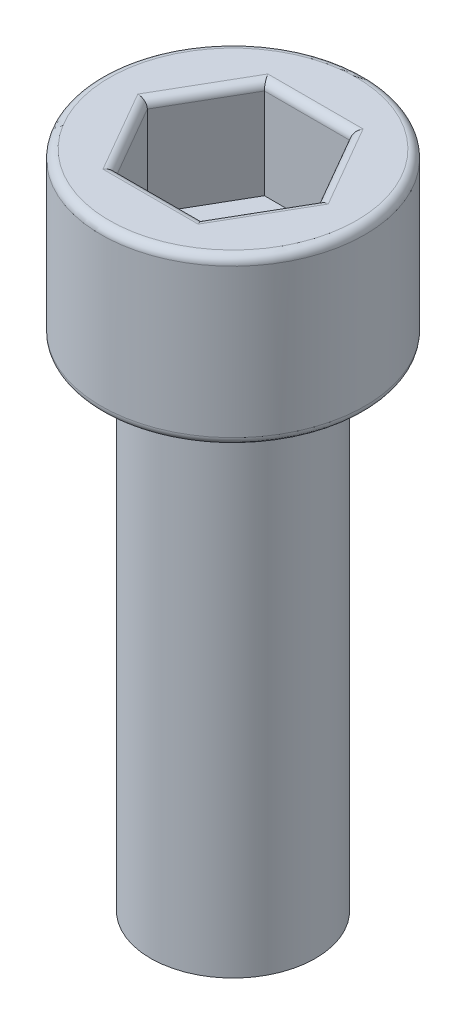
ISO-10303-21;
HEADER;
FILE_DESCRIPTION(('STEP AP214'),'2;1');
FILE_NAME('part.step','',(''),(''),'','','');
FILE_SCHEMA(('AUTOMOTIVE_DESIGN { 1 0 10303 214 1 1 1 1 }'));
ENDSEC;
DATA;
#1=APPLICATION_CONTEXT('core data for automotive mechanical design processes');
#2=APPLICATION_PROTOCOL_DEFINITION('international standard','automotive_design',2000,#1);
#3=PRODUCT_CONTEXT('',#1,'mechanical');
#4=PRODUCT('Part','Part','',(#3));
#5=PRODUCT_RELATED_PRODUCT_CATEGORY('part','',(#4));
#6=PRODUCT_DEFINITION_FORMATION('','',#4);
#7=PRODUCT_DEFINITION_CONTEXT('part definition',#1,'design');
#8=PRODUCT_DEFINITION('design','',#6,#7);
#9=PRODUCT_DEFINITION_SHAPE('','',#8);
#10=(LENGTH_UNIT() NAMED_UNIT(*) SI_UNIT(.MILLI.,.METRE.));
#11=(NAMED_UNIT(*) PLANE_ANGLE_UNIT() SI_UNIT($,.RADIAN.));
#12=(NAMED_UNIT(*) SI_UNIT($,.STERADIAN.) SOLID_ANGLE_UNIT());
#13=UNCERTAINTY_MEASURE_WITH_UNIT(LENGTH_MEASURE(1.E-05),#10,'distance_accuracy_value','');
#14=(GEOMETRIC_REPRESENTATION_CONTEXT(3) GLOBAL_UNCERTAINTY_ASSIGNED_CONTEXT((#13)) GLOBAL_UNIT_ASSIGNED_CONTEXT((#10,
#11,#12)) REPRESENTATION_CONTEXT('',''));
#15=CARTESIAN_POINT('',(0.,0.,0.));
#16=DIRECTION('',(0.,0.,1.));
#17=DIRECTION('',(1.,0.,0.));
#18=AXIS2_PLACEMENT_3D('',#15,#16,#17);
#19=CARTESIAN_POINT('',(2.44936308177216E-11,5.,0.));
#20=DIRECTION('',(0.,-1.,0.));
#21=DIRECTION('',(1.,0.,0.));
#22=AXIS2_PLACEMENT_3D('',#19,#20,#21);
#23=PLANE('',#22);
#24=CARTESIAN_POINT('',(0.,5.,0.));
#25=DIRECTION('',(0.,-1.,0.));
#26=DIRECTION('',(1.,0.,0.));
#27=AXIS2_PLACEMENT_3D('',#24,#25,#26);
#28=CIRCLE('',#27,3.75000000002449);
#29=CARTESIAN_POINT('',(3.75000000002449,5.,0.));
#30=VERTEX_POINT('',#29);
#31=EDGE_CURVE('E179',#30,#30,#28,.F.);
#32=ORIENTED_EDGE('',*,*,#31,.T.);
#33=EDGE_LOOP('',(#32));
#34=FACE_BOUND('',#33,.T.);
#35=DIRECTION('',(-0.5,0.,0.866025403784439));
#36=VECTOR('',#35,1.);
#37=CARTESIAN_POINT('',(-2.16506350945497,5.,-1.25000000001061));
#38=LINE('',#37,#36);
#39=CARTESIAN_POINT('',(-2.88675134594813,5.,0.));
#40=VERTEX_POINT('',#39);
#41=CARTESIAN_POINT('',(-1.44337567297406,5.,-2.5));
#42=VERTEX_POINT('',#41);
#43=EDGE_CURVE('E174',#40,#42,#38,.F.);
#44=ORIENTED_EDGE('',*,*,#43,.T.);
#45=DIRECTION('',(-1.,0.,0.));
#46=VECTOR('',#45,1.);
#47=CARTESIAN_POINT('',(2.44944654369431E-11,5.,-2.5));
#48=LINE('',#47,#46);
#49=CARTESIAN_POINT('',(1.44337567297406,5.,-2.5));
#50=VERTEX_POINT('',#49);
#51=EDGE_CURVE('E176',#42,#50,#48,.F.);
#52=ORIENTED_EDGE('',*,*,#51,.T.);
#53=DIRECTION('',(-0.5,0.,-0.866025403784439));
#54=VECTOR('',#53,1.);
#55=CARTESIAN_POINT('',(2.16506350946722,5.,-1.24999999998939));
#56=LINE('',#55,#54);
#57=CARTESIAN_POINT('',(2.88675134594813,5.,0.));
#58=VERTEX_POINT('',#57);
#59=EDGE_CURVE('E166',#50,#58,#56,.F.);
#60=ORIENTED_EDGE('',*,*,#59,.T.);
#61=DIRECTION('',(0.5,0.,-0.866025403784439));
#62=VECTOR('',#61,1.);
#63=CARTESIAN_POINT('',(2.16506350946722,5.,1.24999999998939));
#64=LINE('',#63,#62);
#65=CARTESIAN_POINT('',(1.44337567297406,5.,2.5));
#66=VERTEX_POINT('',#65);
#67=EDGE_CURVE('E168',#58,#66,#64,.F.);
#68=ORIENTED_EDGE('',*,*,#67,.T.);
#69=DIRECTION('',(1.,0.,0.));
#70=VECTOR('',#69,1.);
#71=CARTESIAN_POINT('',(2.44927961985E-11,5.,2.5));
#72=LINE('',#71,#70);
#73=CARTESIAN_POINT('',(-1.44337567297407,5.,2.5));
#74=VERTEX_POINT('',#73);
#75=EDGE_CURVE('E170',#66,#74,#72,.F.);
#76=ORIENTED_EDGE('',*,*,#75,.T.);
#77=DIRECTION('',(0.5,0.,0.866025403784439));
#78=VECTOR('',#77,1.);
#79=CARTESIAN_POINT('',(-2.16506350945497,5.,1.25000000001061));
#80=LINE('',#79,#78);
#81=EDGE_CURVE('E172',#74,#40,#80,.F.);
#82=ORIENTED_EDGE('',*,*,#81,.T.);
#83=EDGE_LOOP('',(#44,#52,#60,#68,#76,#82));
#84=FACE_BOUND('',#83,.T.);
#85=ADVANCED_FACE('F33',(#34,#84),#23,.F.);
#86=CARTESIAN_POINT('',(0.,21.3223243250921,0.));
#87=DIRECTION('',(0.,1.,0.));
#88=DIRECTION('',(-1.,0.,0.));
#89=AXIS2_PLACEMENT_3D('',#86,#87,#88);
#90=CYLINDRICAL_SURFACE('',#89,4.00000000002449);
#91=CARTESIAN_POINT('',(0.,0.25,0.));
#92=DIRECTION('',(0.,1.,0.));
#93=DIRECTION('',(-1.,0.,0.));
#94=AXIS2_PLACEMENT_3D('',#91,#92,#93);
#95=CIRCLE('',#94,4.00000000002449);
#96=CARTESIAN_POINT('',(-4.00000000002449,0.25,0.));
#97=VERTEX_POINT('',#96);
#98=EDGE_CURVE('E163',#97,#97,#95,.T.);
#99=ORIENTED_EDGE('',*,*,#98,.T.);
#100=EDGE_LOOP('',(#99));
#101=FACE_BOUND('',#100,.T.);
#102=CARTESIAN_POINT('',(0.,4.75,0.));
#103=DIRECTION('',(0.,-1.,0.));
#104=DIRECTION('',(1.,0.,0.));
#105=AXIS2_PLACEMENT_3D('',#102,#103,#104);
#106=CIRCLE('',#105,4.00000000002449);
#107=CARTESIAN_POINT('',(4.00000000002449,4.75,0.));
#108=VERTEX_POINT('',#107);
#109=EDGE_CURVE('E160',#108,#108,#106,.T.);
#110=ORIENTED_EDGE('',*,*,#109,.T.);
#111=EDGE_LOOP('',(#110));
#112=FACE_BOUND('',#111,.T.);
#113=ADVANCED_FACE('F240',(#101,#112),#90,.T.);
#114=CARTESIAN_POINT('',(4.00000000002449,0.,0.));
#115=DIRECTION('',(0.,1.,0.));
#116=DIRECTION('',(-1.,0.,0.));
#117=AXIS2_PLACEMENT_3D('',#114,#115,#116);
#118=PLANE('',#117);
#119=CARTESIAN_POINT('',(0.,0.,0.));
#120=DIRECTION('',(0.,1.,0.));
#121=DIRECTION('',(-1.,0.,0.));
#122=AXIS2_PLACEMENT_3D('',#119,#120,#121);
#123=CIRCLE('',#122,2.75);
#124=CARTESIAN_POINT('',(-2.75,0.,0.));
#125=VERTEX_POINT('',#124);
#126=EDGE_CURVE('E154',#125,#125,#123,.T.);
#127=ORIENTED_EDGE('',*,*,#126,.T.);
#128=EDGE_LOOP('',(#127));
#129=FACE_BOUND('',#128,.T.);
#130=CARTESIAN_POINT('',(0.,0.,0.));
#131=DIRECTION('',(0.,1.,0.));
#132=DIRECTION('',(-1.,0.,0.));
#133=AXIS2_PLACEMENT_3D('',#130,#131,#132);
#134=CIRCLE('',#133,3.75000000002449);
#135=CARTESIAN_POINT('',(-3.75000000002449,0.,0.));
#136=VERTEX_POINT('',#135);
#137=EDGE_CURVE('E151',#136,#136,#134,.F.);
#138=ORIENTED_EDGE('',*,*,#137,.T.);
#139=EDGE_LOOP('',(#138));
#140=FACE_BOUND('',#139,.T.);
#141=ADVANCED_FACE('F246',(#129,#140),#118,.F.);
#142=CARTESIAN_POINT('',(0.,21.3223243250921,0.));
#143=DIRECTION('',(0.,1.,0.));
#144=DIRECTION('',(-1.,0.,0.));
#145=AXIS2_PLACEMENT_3D('',#142,#143,#144);
#146=CYLINDRICAL_SURFACE('',#145,2.5);
#147=CARTESIAN_POINT('',(0.,-0.25,0.));
#148=DIRECTION('',(0.,1.,0.));
#149=DIRECTION('',(-1.,0.,0.));
#150=AXIS2_PLACEMENT_3D('',#147,#148,#149);
#151=CIRCLE('',#150,2.5);
#152=CARTESIAN_POINT('',(-2.49999999999999,-0.250000000000001,0.));
#153=VERTEX_POINT('',#152);
#154=EDGE_CURVE('E157',#153,#153,#151,.F.);
#155=ORIENTED_EDGE('',*,*,#154,.T.);
#156=EDGE_LOOP('',(#155));
#157=FACE_BOUND('',#156,.T.);
#158=CARTESIAN_POINT('',(0.,-15.,0.));
#159=DIRECTION('',(0.,1.,0.));
#160=DIRECTION('',(-1.,0.,0.));
#161=AXIS2_PLACEMENT_3D('',#158,#159,#160);
#162=CIRCLE('',#161,2.5);
#163=CARTESIAN_POINT('',(-2.49999999999999,-15.,0.));
#164=VERTEX_POINT('',#163);
#165=EDGE_CURVE('E139',#164,#164,#162,.T.);
#166=ORIENTED_EDGE('',*,*,#165,.T.);
#167=EDGE_LOOP('',(#166));
#168=FACE_BOUND('',#167,.T.);
#169=ADVANCED_FACE('F338',(#157,#168),#146,.T.);
#170=CARTESIAN_POINT('',(2.5,-15.,0.));
#171=DIRECTION('',(0.,1.,0.));
#172=DIRECTION('',(-1.,0.,0.));
#173=AXIS2_PLACEMENT_3D('',#170,#171,#172);
#174=PLANE('',#173);
#175=ORIENTED_EDGE('',*,*,#165,.F.);
#176=EDGE_LOOP('',(#175));
#177=FACE_BOUND('',#176,.T.);
#178=ADVANCED_FACE('F236',(#177),#174,.F.);
#179=CARTESIAN_POINT('',(1.29903810567666,2.,2.25));
#180=DIRECTION('',(0.866025403784439,0.,0.5));
#181=DIRECTION('',(0.5,0.,-0.866025403784439));
#182=AXIS2_PLACEMENT_3D('',#179,#180,#181);
#183=PLANE('',#182);
#184=DIRECTION('',(0.,1.,0.));
#185=VECTOR('',#184,1.);
#186=CARTESIAN_POINT('',(1.29903810567666,2.,2.25));
#187=LINE('',#186,#185);
#188=CARTESIAN_POINT('',(1.29903810567666,2.,2.25));
#189=VERTEX_POINT('',#188);
#190=CARTESIAN_POINT('',(1.29903810567666,4.75,2.25));
#191=VERTEX_POINT('',#190);
#192=EDGE_CURVE('E137',#189,#191,#187,.T.);
#193=ORIENTED_EDGE('',*,*,#192,.T.);
#194=DIRECTION('',(0.5,0.,-0.866025403784439));
#195=VECTOR('',#194,1.);
#196=CARTESIAN_POINT('',(1.29903810567666,4.75,2.25));
#197=LINE('',#196,#195);
#198=CARTESIAN_POINT('',(2.59807621135332,4.75,0.));
#199=VERTEX_POINT('',#198);
#200=EDGE_CURVE('E42',#191,#199,#197,.T.);
#201=ORIENTED_EDGE('',*,*,#200,.T.);
#202=DIRECTION('',(0.,1.,0.));
#203=VECTOR('',#202,1.);
#204=CARTESIAN_POINT('',(2.59807621135332,2.,0.));
#205=LINE('',#204,#203);
#206=CARTESIAN_POINT('',(2.59807621135332,2.,0.));
#207=VERTEX_POINT('',#206);
#208=EDGE_CURVE('E103',#207,#199,#205,.T.);
#209=ORIENTED_EDGE('',*,*,#208,.F.);
#210=DIRECTION('',(0.5,0.,-0.866025403784439));
#211=VECTOR('',#210,1.);
#212=CARTESIAN_POINT('',(1.29903810567666,2.,2.25));
#213=LINE('',#212,#211);
#214=EDGE_CURVE('E107',#189,#207,#213,.T.);
#215=ORIENTED_EDGE('',*,*,#214,.F.);
#216=EDGE_LOOP('',(#193,#201,#209,#215));
#217=FACE_BOUND('',#216,.T.);
#218=ADVANCED_FACE('F105',(#217),#183,.F.);
#219=CARTESIAN_POINT('',(-1.29903810567666,2.,2.25));
#220=DIRECTION('',(0.,0.,1.));
#221=DIRECTION('',(1.,0.,0.));
#222=AXIS2_PLACEMENT_3D('',#219,#220,#221);
#223=PLANE('',#222);
#224=DIRECTION('',(0.,1.,0.));
#225=VECTOR('',#224,1.);
#226=CARTESIAN_POINT('',(-1.29903810567666,2.,2.25));
#227=LINE('',#226,#225);
#228=CARTESIAN_POINT('',(-1.29903810567666,2.,2.25));
#229=VERTEX_POINT('',#228);
#230=CARTESIAN_POINT('',(-1.29903810567666,4.75,2.25));
#231=VERTEX_POINT('',#230);
#232=EDGE_CURVE('E140',#229,#231,#227,.T.);
#233=ORIENTED_EDGE('',*,*,#232,.T.);
#234=DIRECTION('',(1.,0.,0.));
#235=VECTOR('',#234,1.);
#236=CARTESIAN_POINT('',(-1.29903810567666,4.75,2.25));
#237=LINE('',#236,#235);
#238=EDGE_CURVE('E57',#231,#191,#237,.T.);
#239=ORIENTED_EDGE('',*,*,#238,.T.);
#240=ORIENTED_EDGE('',*,*,#192,.F.);
#241=DIRECTION('',(1.,0.,0.));
#242=VECTOR('',#241,1.);
#243=CARTESIAN_POINT('',(-1.29903810567666,2.,2.25));
#244=LINE('',#243,#242);
#245=EDGE_CURVE('E112',#229,#189,#244,.T.);
#246=ORIENTED_EDGE('',*,*,#245,.F.);
#247=EDGE_LOOP('',(#233,#239,#240,#246));
#248=FACE_BOUND('',#247,.T.);
#249=ADVANCED_FACE('F228',(#248),#223,.F.);
#250=CARTESIAN_POINT('',(-2.59807621135332,2.,0.));
#251=DIRECTION('',(-0.866025403784439,0.,0.5));
#252=DIRECTION('',(0.5,0.,0.866025403784439));
#253=AXIS2_PLACEMENT_3D('',#250,#251,#252);
#254=PLANE('',#253);
#255=DIRECTION('',(0.,1.,0.));
#256=VECTOR('',#255,1.);
#257=CARTESIAN_POINT('',(-2.59807621135332,2.,0.));
#258=LINE('',#257,#256);
#259=CARTESIAN_POINT('',(-2.59807621135332,2.,0.));
#260=VERTEX_POINT('',#259);
#261=CARTESIAN_POINT('',(-2.59807621135332,4.75,0.));
#262=VERTEX_POINT('',#261);
#263=EDGE_CURVE('E142',#260,#262,#258,.T.);
#264=ORIENTED_EDGE('',*,*,#263,.T.);
#265=DIRECTION('',(0.5,0.,0.866025403784439));
#266=VECTOR('',#265,1.);
#267=CARTESIAN_POINT('',(-2.59807621135332,4.75,0.));
#268=LINE('',#267,#266);
#269=EDGE_CURVE('E187',#262,#231,#268,.T.);
#270=ORIENTED_EDGE('',*,*,#269,.T.);
#271=ORIENTED_EDGE('',*,*,#232,.F.);
#272=DIRECTION('',(0.5,0.,0.866025403784439));
#273=VECTOR('',#272,1.);
#274=CARTESIAN_POINT('',(-2.59807621135332,2.,0.));
#275=LINE('',#274,#273);
#276=EDGE_CURVE('E134',#260,#229,#275,.T.);
#277=ORIENTED_EDGE('',*,*,#276,.F.);
#278=EDGE_LOOP('',(#264,#270,#271,#277));
#279=FACE_BOUND('',#278,.T.);
#280=ADVANCED_FACE('F227',(#279),#254,.F.);
#281=CARTESIAN_POINT('',(-1.29903810567666,2.,-2.25));
#282=DIRECTION('',(-0.866025403784439,0.,-0.5));
#283=DIRECTION('',(-0.5,0.,0.866025403784439));
#284=AXIS2_PLACEMENT_3D('',#281,#282,#283);
#285=PLANE('',#284);
#286=DIRECTION('',(0.,1.,0.));
#287=VECTOR('',#286,1.);
#288=CARTESIAN_POINT('',(-1.29903810567666,2.,-2.25));
#289=LINE('',#288,#287);
#290=CARTESIAN_POINT('',(-1.29903810567666,2.,-2.25));
#291=VERTEX_POINT('',#290);
#292=CARTESIAN_POINT('',(-1.29903810567666,4.75,-2.25));
#293=VERTEX_POINT('',#292);
#294=EDGE_CURVE('E145',#291,#293,#289,.T.);
#295=ORIENTED_EDGE('',*,*,#294,.T.);
#296=DIRECTION('',(-0.5,0.,0.866025403784439));
#297=VECTOR('',#296,1.);
#298=CARTESIAN_POINT('',(-1.29903810567666,4.75,-2.25));
#299=LINE('',#298,#297);
#300=EDGE_CURVE('E185',#293,#262,#299,.T.);
#301=ORIENTED_EDGE('',*,*,#300,.T.);
#302=ORIENTED_EDGE('',*,*,#263,.F.);
#303=DIRECTION('',(-0.5,0.,0.866025403784439));
#304=VECTOR('',#303,1.);
#305=CARTESIAN_POINT('',(-1.29903810567666,2.,-2.25));
#306=LINE('',#305,#304);
#307=EDGE_CURVE('E131',#291,#260,#306,.T.);
#308=ORIENTED_EDGE('',*,*,#307,.F.);
#309=EDGE_LOOP('',(#295,#301,#302,#308));
#310=FACE_BOUND('',#309,.T.);
#311=ADVANCED_FACE('F224',(#310),#285,.F.);
#312=CARTESIAN_POINT('',(1.29903810567666,2.,-2.25));
#313=DIRECTION('',(0.,0.,-1.));
#314=DIRECTION('',(-1.,0.,0.));
#315=AXIS2_PLACEMENT_3D('',#312,#313,#314);
#316=PLANE('',#315);
#317=DIRECTION('',(0.,1.,0.));
#318=VECTOR('',#317,1.);
#319=CARTESIAN_POINT('',(1.29903810567666,2.,-2.25));
#320=LINE('',#319,#318);
#321=CARTESIAN_POINT('',(1.29903810567666,2.,-2.25));
#322=VERTEX_POINT('',#321);
#323=CARTESIAN_POINT('',(1.29903810567666,4.75,-2.25));
#324=VERTEX_POINT('',#323);
#325=EDGE_CURVE('E111',#322,#324,#320,.T.);
#326=ORIENTED_EDGE('',*,*,#325,.T.);
#327=DIRECTION('',(-1.,0.,0.));
#328=VECTOR('',#327,1.);
#329=CARTESIAN_POINT('',(1.29903810567666,4.75,-2.25));
#330=LINE('',#329,#328);
#331=EDGE_CURVE('E182',#324,#293,#330,.T.);
#332=ORIENTED_EDGE('',*,*,#331,.T.);
#333=ORIENTED_EDGE('',*,*,#294,.F.);
#334=DIRECTION('',(-1.,0.,0.));
#335=VECTOR('',#334,1.);
#336=CARTESIAN_POINT('',(1.29903810567666,2.,-2.25));
#337=LINE('',#336,#335);
#338=EDGE_CURVE('E121',#322,#291,#337,.T.);
#339=ORIENTED_EDGE('',*,*,#338,.F.);
#340=EDGE_LOOP('',(#326,#332,#333,#339));
#341=FACE_BOUND('',#340,.T.);
#342=ADVANCED_FACE('F220',(#341),#316,.F.);
#343=CARTESIAN_POINT('',(2.59807621135332,2.,0.));
#344=DIRECTION('',(0.866025403784439,0.,-0.5));
#345=DIRECTION('',(-0.5,0.,-0.866025403784439));
#346=AXIS2_PLACEMENT_3D('',#343,#344,#345);
#347=PLANE('',#346);
#348=ORIENTED_EDGE('',*,*,#208,.T.);
#349=DIRECTION('',(-0.5,0.,-0.866025403784439));
#350=VECTOR('',#349,1.);
#351=CARTESIAN_POINT('',(2.59807621135332,4.75,0.));
#352=LINE('',#351,#350);
#353=EDGE_CURVE('E11',#199,#324,#352,.T.);
#354=ORIENTED_EDGE('',*,*,#353,.T.);
#355=ORIENTED_EDGE('',*,*,#325,.F.);
#356=DIRECTION('',(-0.5,0.,-0.866025403784439));
#357=VECTOR('',#356,1.);
#358=CARTESIAN_POINT('',(2.59807621135332,2.,0.));
#359=LINE('',#358,#357);
#360=EDGE_CURVE('E115',#207,#322,#359,.T.);
#361=ORIENTED_EDGE('',*,*,#360,.F.);
#362=EDGE_LOOP('',(#348,#354,#355,#361));
#363=FACE_BOUND('',#362,.T.);
#364=ADVANCED_FACE('F116',(#363),#347,.F.);
#365=CARTESIAN_POINT('',(0.,2.,0.));
#366=DIRECTION('',(0.,1.,0.));
#367=DIRECTION('',(0.,0.,1.));
#368=AXIS2_PLACEMENT_3D('',#365,#366,#367);
#369=PLANE('',#368);
#370=ORIENTED_EDGE('',*,*,#214,.T.);
#371=ORIENTED_EDGE('',*,*,#360,.T.);
#372=ORIENTED_EDGE('',*,*,#338,.T.);
#373=ORIENTED_EDGE('',*,*,#307,.T.);
#374=ORIENTED_EDGE('',*,*,#276,.T.);
#375=ORIENTED_EDGE('',*,*,#245,.T.);
#376=EDGE_LOOP('',(#370,#371,#372,#373,#374,#375));
#377=FACE_BOUND('',#376,.T.);
#378=ADVANCED_FACE('F123',(#377),#369,.T.);
#379=CARTESIAN_POINT('',(0.,-0.25,0.));
#380=DIRECTION('',(0.,1.,0.));
#381=DIRECTION('',(-1.,0.,0.));
#382=AXIS2_PLACEMENT_3D('',#379,#380,#381);
#383=TOROIDAL_SURFACE('',#382,2.75,0.25);
#384=ORIENTED_EDGE('',*,*,#154,.F.);
#385=EDGE_LOOP('',(#384));
#386=FACE_BOUND('',#385,.T.);
#387=ORIENTED_EDGE('',*,*,#126,.F.);
#388=EDGE_LOOP('',(#387));
#389=FACE_BOUND('',#388,.T.);
#390=ADVANCED_FACE('F252',(#386,#389),#383,.F.);
#391=CARTESIAN_POINT('',(0.,0.25,0.));
#392=DIRECTION('',(0.,1.,0.));
#393=DIRECTION('',(-1.,0.,0.));
#394=AXIS2_PLACEMENT_3D('',#391,#392,#393);
#395=TOROIDAL_SURFACE('',#394,3.75000000002449,0.25);
#396=ORIENTED_EDGE('',*,*,#137,.F.);
#397=EDGE_LOOP('',(#396));
#398=FACE_BOUND('',#397,.T.);
#399=ORIENTED_EDGE('',*,*,#98,.F.);
#400=EDGE_LOOP('',(#399));
#401=FACE_BOUND('',#400,.T.);
#402=ADVANCED_FACE('F255',(#398,#401),#395,.T.);
#403=CARTESIAN_POINT('',(0.,4.75,0.));
#404=DIRECTION('',(0.,-1.,0.));
#405=DIRECTION('',(1.,0.,0.));
#406=AXIS2_PLACEMENT_3D('',#403,#404,#405);
#407=TOROIDAL_SURFACE('',#406,3.75000000002449,0.25);
#408=ORIENTED_EDGE('',*,*,#109,.F.);
#409=EDGE_LOOP('',(#408));
#410=FACE_BOUND('',#409,.T.);
#411=ORIENTED_EDGE('',*,*,#31,.F.);
#412=EDGE_LOOP('',(#411));
#413=FACE_BOUND('',#412,.T.);
#414=ADVANCED_FACE('F259',(#410,#413),#407,.T.);
#415=CARTESIAN_POINT('',(-1.29903810567666,4.75,2.5));
#416=DIRECTION('',(1.,0.,0.));
#417=DIRECTION('',(0.,0.,-1.));
#418=AXIS2_PLACEMENT_3D('',#415,#416,#417);
#419=CYLINDRICAL_SURFACE('',#418,0.25);
#420=CARTESIAN_POINT('',(-1.44337567297407,4.75,2.5));
#421=DIRECTION('',(0.866025403784438,0.,0.5));
#422=DIRECTION('',(-0.5,0.,0.866025403784439));
#423=AXIS2_PLACEMENT_3D('',#420,#421,#422);
#424=ELLIPSE('',#423,0.288675134594813,0.25);
#425=EDGE_CURVE('E128',#74,#231,#424,.F.);
#426=ORIENTED_EDGE('',*,*,#425,.F.);
#427=ORIENTED_EDGE('',*,*,#75,.F.);
#428=CARTESIAN_POINT('',(1.44337567297406,4.75,2.5));
#429=DIRECTION('',(0.866025403784439,0.,-0.5));
#430=DIRECTION('',(0.5,0.,0.866025403784439));
#431=AXIS2_PLACEMENT_3D('',#428,#429,#430);
#432=ELLIPSE('',#431,0.288675134594813,0.25);
#433=EDGE_CURVE('E37',#191,#66,#432,.T.);
#434=ORIENTED_EDGE('',*,*,#433,.F.);
#435=ORIENTED_EDGE('',*,*,#238,.F.);
#436=EDGE_LOOP('',(#426,#427,#434,#435));
#437=FACE_BOUND('',#436,.T.);
#438=ADVANCED_FACE('F35',(#437),#419,.T.);
#439=CARTESIAN_POINT('',(1.51554445662277,4.75,2.375));
#440=DIRECTION('',(0.5,0.,-0.866025403784439));
#441=DIRECTION('',(-0.866025403784439,0.,-0.5));
#442=AXIS2_PLACEMENT_3D('',#439,#440,#441);
#443=CYLINDRICAL_SURFACE('',#442,0.25);
#444=ORIENTED_EDGE('',*,*,#433,.T.);
#445=ORIENTED_EDGE('',*,*,#67,.F.);
#446=CARTESIAN_POINT('',(2.88675134594813,4.75,0.));
#447=DIRECTION('',(0.,0.,-1.));
#448=DIRECTION('',(1.,0.,0.));
#449=AXIS2_PLACEMENT_3D('',#446,#447,#448);
#450=ELLIPSE('',#449,0.288675134594813,0.25);
#451=EDGE_CURVE('E198',#199,#58,#450,.T.);
#452=ORIENTED_EDGE('',*,*,#451,.F.);
#453=ORIENTED_EDGE('',*,*,#200,.F.);
#454=EDGE_LOOP('',(#444,#445,#452,#453));
#455=FACE_BOUND('',#454,.T.);
#456=ADVANCED_FACE('F212',(#455),#443,.T.);
#457=CARTESIAN_POINT('',(-2.81458256229943,4.75,0.125));
#458=DIRECTION('',(0.5,0.,0.866025403784439));
#459=DIRECTION('',(0.866025403784439,0.,-0.5));
#460=AXIS2_PLACEMENT_3D('',#457,#458,#459);
#461=CYLINDRICAL_SURFACE('',#460,0.25);
#462=ORIENTED_EDGE('',*,*,#425,.T.);
#463=ORIENTED_EDGE('',*,*,#269,.F.);
#464=CARTESIAN_POINT('',(-2.88675134594813,4.75,0.));
#465=DIRECTION('',(0.,0.,1.));
#466=DIRECTION('',(-1.,0.,0.));
#467=AXIS2_PLACEMENT_3D('',#464,#465,#466);
#468=ELLIPSE('',#467,0.288675134594813,0.25);
#469=EDGE_CURVE('E195',#40,#262,#468,.F.);
#470=ORIENTED_EDGE('',*,*,#469,.F.);
#471=ORIENTED_EDGE('',*,*,#81,.F.);
#472=EDGE_LOOP('',(#462,#463,#470,#471));
#473=FACE_BOUND('',#472,.T.);
#474=ADVANCED_FACE('F205',(#473),#461,.T.);
#475=CARTESIAN_POINT('',(2.81458256229942,4.75,-0.125));
#476=DIRECTION('',(-0.5,0.,-0.866025403784439));
#477=DIRECTION('',(-0.866025403784439,0.,0.5));
#478=AXIS2_PLACEMENT_3D('',#475,#476,#477);
#479=CYLINDRICAL_SURFACE('',#478,0.25);
#480=ORIENTED_EDGE('',*,*,#451,.T.);
#481=ORIENTED_EDGE('',*,*,#59,.F.);
#482=CARTESIAN_POINT('',(1.44337567297406,4.75,-2.5));
#483=DIRECTION('',(-0.866025403784438,0.,-0.5));
#484=DIRECTION('',(-0.5,0.,0.866025403784439));
#485=AXIS2_PLACEMENT_3D('',#482,#483,#484);
#486=ELLIPSE('',#485,0.288675134594813,0.25);
#487=EDGE_CURVE('E193',#324,#50,#486,.T.);
#488=ORIENTED_EDGE('',*,*,#487,.F.);
#489=ORIENTED_EDGE('',*,*,#353,.F.);
#490=EDGE_LOOP('',(#480,#481,#488,#489));
#491=FACE_BOUND('',#490,.T.);
#492=ADVANCED_FACE('F217',(#491),#479,.T.);
#493=CARTESIAN_POINT('',(-1.51554445662277,4.75,-2.375));
#494=DIRECTION('',(-0.5,0.,0.866025403784439));
#495=DIRECTION('',(0.866025403784439,0.,0.5));
#496=AXIS2_PLACEMENT_3D('',#493,#494,#495);
#497=CYLINDRICAL_SURFACE('',#496,0.25);
#498=ORIENTED_EDGE('',*,*,#469,.T.);
#499=ORIENTED_EDGE('',*,*,#300,.F.);
#500=CARTESIAN_POINT('',(-1.44337567297406,4.75,-2.5));
#501=DIRECTION('',(-0.866025403784439,0.,0.5));
#502=DIRECTION('',(-0.5,0.,-0.866025403784439));
#503=AXIS2_PLACEMENT_3D('',#500,#501,#502);
#504=ELLIPSE('',#503,0.288675134594813,0.25);
#505=EDGE_CURVE('E191',#42,#293,#504,.F.);
#506=ORIENTED_EDGE('',*,*,#505,.F.);
#507=ORIENTED_EDGE('',*,*,#43,.F.);
#508=EDGE_LOOP('',(#498,#499,#506,#507));
#509=FACE_BOUND('',#508,.T.);
#510=ADVANCED_FACE('F267',(#509),#497,.T.);
#511=CARTESIAN_POINT('',(1.29903810567666,4.75,-2.5));
#512=DIRECTION('',(-1.,0.,0.));
#513=DIRECTION('',(0.,0.,1.));
#514=AXIS2_PLACEMENT_3D('',#511,#512,#513);
#515=CYLINDRICAL_SURFACE('',#514,0.25);
#516=ORIENTED_EDGE('',*,*,#487,.T.);
#517=ORIENTED_EDGE('',*,*,#51,.F.);
#518=ORIENTED_EDGE('',*,*,#505,.T.);
#519=ORIENTED_EDGE('',*,*,#331,.F.);
#520=EDGE_LOOP('',(#516,#517,#518,#519));
#521=FACE_BOUND('',#520,.T.);
#522=ADVANCED_FACE('F264',(#521),#515,.T.);
#523=CLOSED_SHELL('',(#85,#113,#141,#169,#178,#218,#249,#280,#311,#342,#364,#378,#390,#402,#414,
#438,#456,#474,#492,#510,#522));
#524=MANIFOLD_SOLID_BREP('B2',#523);
#525=ADVANCED_BREP_SHAPE_REPRESENTATION('',(#18,#524),#14);
#526=SHAPE_DEFINITION_REPRESENTATION(#9,#525);
ENDSEC;
END-ISO-10303-21;
